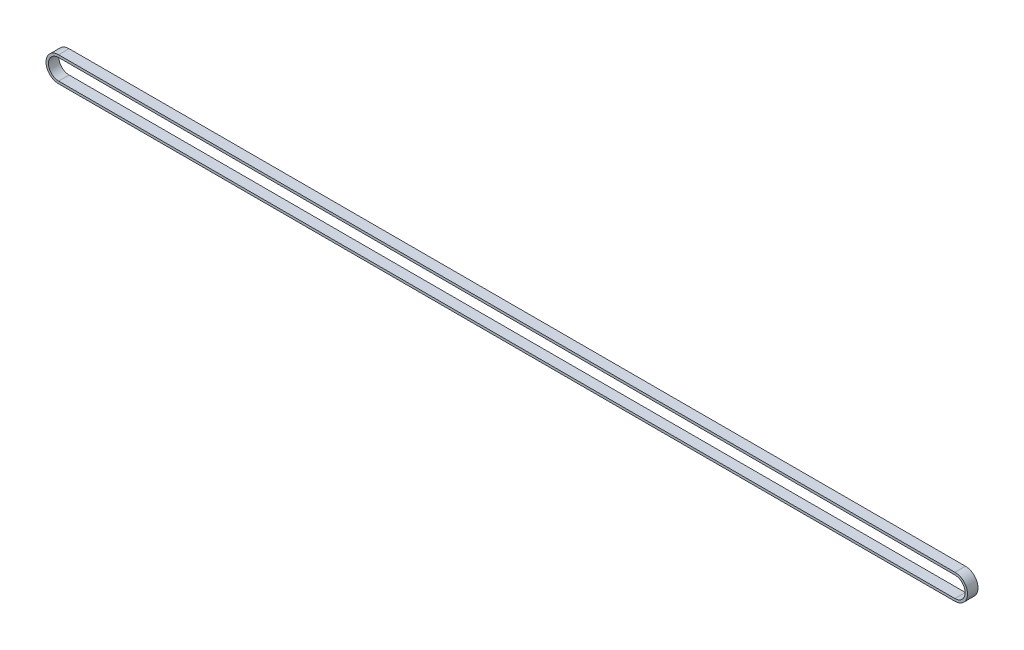
ISO-10303-21;
HEADER;
FILE_DESCRIPTION(('STEP AP214'),'2;1');
FILE_NAME('part.step','',(''),(''),'','','');
FILE_SCHEMA(('AUTOMOTIVE_DESIGN { 1 0 10303 214 1 1 1 1 }'));
ENDSEC;
DATA;
#1=APPLICATION_CONTEXT('core data for automotive mechanical design processes');
#2=APPLICATION_PROTOCOL_DEFINITION('international standard','automotive_design',2000,#1);
#3=PRODUCT_CONTEXT('',#1,'mechanical');
#4=PRODUCT('Part','Part','',(#3));
#5=PRODUCT_RELATED_PRODUCT_CATEGORY('part','',(#4));
#6=PRODUCT_DEFINITION_FORMATION('','',#4);
#7=PRODUCT_DEFINITION_CONTEXT('part definition',#1,'design');
#8=PRODUCT_DEFINITION('design','',#6,#7);
#9=PRODUCT_DEFINITION_SHAPE('','',#8);
#10=(LENGTH_UNIT() NAMED_UNIT(*) SI_UNIT(.MILLI.,.METRE.));
#11=(NAMED_UNIT(*) PLANE_ANGLE_UNIT() SI_UNIT($,.RADIAN.));
#12=(NAMED_UNIT(*) SI_UNIT($,.STERADIAN.) SOLID_ANGLE_UNIT());
#13=UNCERTAINTY_MEASURE_WITH_UNIT(LENGTH_MEASURE(1.E-05),#10,'distance_accuracy_value','');
#14=(GEOMETRIC_REPRESENTATION_CONTEXT(3) GLOBAL_UNCERTAINTY_ASSIGNED_CONTEXT((#13)) GLOBAL_UNIT_ASSIGNED_CONTEXT((#10,
#11,#12)) REPRESENTATION_CONTEXT('',''));
#15=CARTESIAN_POINT('',(0.,0.,0.));
#16=DIRECTION('',(0.,0.,1.));
#17=DIRECTION('',(1.,0.,0.));
#18=AXIS2_PLACEMENT_3D('',#15,#16,#17);
#19=CARTESIAN_POINT('',(0.,0.,6.));
#20=DIRECTION('',(0.,0.,1.));
#21=DIRECTION('',(1.,0.,0.));
#22=AXIS2_PLACEMENT_3D('',#19,#20,#21);
#23=PLANE('',#22);
#24=CARTESIAN_POINT('',(0.,0.,6.));
#25=DIRECTION('',(0.,0.,1.));
#26=DIRECTION('',(1.,0.,0.));
#27=AXIS2_PLACEMENT_3D('',#24,#25,#26);
#28=CIRCLE('',#27,7.213);
#29=CARTESIAN_POINT('',(0.,7.213,6.));
#30=VERTEX_POINT('',#29);
#31=CARTESIAN_POINT('',(0.,-7.213,6.));
#32=VERTEX_POINT('',#31);
#33=EDGE_CURVE('E133',#30,#32,#28,.T.);
#34=ORIENTED_EDGE('',*,*,#33,.T.);
#35=DIRECTION('',(1.,0.,0.));
#36=VECTOR('',#35,1.);
#37=CARTESIAN_POINT('',(0.,-7.213,6.));
#38=LINE('',#37,#36);
#39=CARTESIAN_POINT('',(513.,-7.213,6.));
#40=VERTEX_POINT('',#39);
#41=EDGE_CURVE('E136',#32,#40,#38,.T.);
#42=ORIENTED_EDGE('',*,*,#41,.T.);
#43=CARTESIAN_POINT('',(513.,0.,6.));
#44=DIRECTION('',(0.,0.,1.));
#45=DIRECTION('',(1.,0.,0.));
#46=AXIS2_PLACEMENT_3D('',#43,#44,#45);
#47=CIRCLE('',#46,7.213);
#48=CARTESIAN_POINT('',(513.,7.213,6.));
#49=VERTEX_POINT('',#48);
#50=EDGE_CURVE('E139',#40,#49,#47,.T.);
#51=ORIENTED_EDGE('',*,*,#50,.T.);
#52=DIRECTION('',(-1.,0.,0.));
#53=VECTOR('',#52,1.);
#54=CARTESIAN_POINT('',(0.,7.213,6.));
#55=LINE('',#54,#53);
#56=EDGE_CURVE('E141',#49,#30,#55,.T.);
#57=ORIENTED_EDGE('',*,*,#56,.T.);
#58=EDGE_LOOP('',(#34,#42,#51,#57));
#59=FACE_BOUND('',#58,.T.);
#60=DIRECTION('',(1.,0.,0.));
#61=VECTOR('',#60,1.);
#62=CARTESIAN_POINT('',(513.,-5.833,6.));
#63=LINE('',#62,#61);
#64=CARTESIAN_POINT('',(0.,-5.833,6.));
#65=VERTEX_POINT('',#64);
#66=CARTESIAN_POINT('',(513.,-5.833,6.));
#67=VERTEX_POINT('',#66);
#68=EDGE_CURVE('E105',#65,#67,#63,.T.);
#69=ORIENTED_EDGE('',*,*,#68,.F.);
#70=CARTESIAN_POINT('',(0.,0.,6.));
#71=DIRECTION('',(0.,0.,1.));
#72=DIRECTION('',(1.,0.,0.));
#73=AXIS2_PLACEMENT_3D('',#70,#71,#72);
#74=CIRCLE('',#73,5.833);
#75=CARTESIAN_POINT('',(0.,5.833,6.));
#76=VERTEX_POINT('',#75);
#77=EDGE_CURVE('E97',#76,#65,#74,.T.);
#78=ORIENTED_EDGE('',*,*,#77,.F.);
#79=DIRECTION('',(-1.,0.,0.));
#80=VECTOR('',#79,1.);
#81=CARTESIAN_POINT('',(0.,5.833,6.));
#82=LINE('',#81,#80);
#83=CARTESIAN_POINT('',(513.,5.833,6.));
#84=VERTEX_POINT('',#83);
#85=EDGE_CURVE('E119',#84,#76,#82,.T.);
#86=ORIENTED_EDGE('',*,*,#85,.F.);
#87=CARTESIAN_POINT('',(513.,0.,6.));
#88=DIRECTION('',(0.,0.,1.));
#89=DIRECTION('',(1.,0.,0.));
#90=AXIS2_PLACEMENT_3D('',#87,#88,#89);
#91=CIRCLE('',#90,5.833);
#92=EDGE_CURVE('E117',#67,#84,#91,.T.);
#93=ORIENTED_EDGE('',*,*,#92,.F.);
#94=EDGE_LOOP('',(#69,#78,#86,#93));
#95=FACE_BOUND('',#94,.T.);
#96=ADVANCED_FACE('F32',(#59,#95),#23,.T.);
#97=CARTESIAN_POINT('',(0.,0.,0.));
#98=DIRECTION('',(0.,0.,1.));
#99=DIRECTION('',(1.,0.,0.));
#100=AXIS2_PLACEMENT_3D('',#97,#98,#99);
#101=PLANE('',#100);
#102=CARTESIAN_POINT('',(0.,0.,0.));
#103=DIRECTION('',(0.,0.,1.));
#104=DIRECTION('',(1.,0.,0.));
#105=AXIS2_PLACEMENT_3D('',#102,#103,#104);
#106=CIRCLE('',#105,7.213);
#107=CARTESIAN_POINT('',(0.,7.213,0.));
#108=VERTEX_POINT('',#107);
#109=CARTESIAN_POINT('',(0.,-7.213,0.));
#110=VERTEX_POINT('',#109);
#111=EDGE_CURVE('E113',#108,#110,#106,.T.);
#112=ORIENTED_EDGE('',*,*,#111,.F.);
#113=DIRECTION('',(-1.,0.,0.));
#114=VECTOR('',#113,1.);
#115=CARTESIAN_POINT('',(0.,7.213,0.));
#116=LINE('',#115,#114);
#117=CARTESIAN_POINT('',(513.,7.213,0.));
#118=VERTEX_POINT('',#117);
#119=EDGE_CURVE('E137',#118,#108,#116,.T.);
#120=ORIENTED_EDGE('',*,*,#119,.F.);
#121=CARTESIAN_POINT('',(513.,0.,0.));
#122=DIRECTION('',(0.,0.,1.));
#123=DIRECTION('',(1.,0.,0.));
#124=AXIS2_PLACEMENT_3D('',#121,#122,#123);
#125=CIRCLE('',#124,7.213);
#126=CARTESIAN_POINT('',(513.,-7.213,0.));
#127=VERTEX_POINT('',#126);
#128=EDGE_CURVE('E148',#127,#118,#125,.T.);
#129=ORIENTED_EDGE('',*,*,#128,.F.);
#130=DIRECTION('',(1.,0.,0.));
#131=VECTOR('',#130,1.);
#132=CARTESIAN_POINT('',(0.,-7.213,0.));
#133=LINE('',#132,#131);
#134=EDGE_CURVE('E146',#110,#127,#133,.T.);
#135=ORIENTED_EDGE('',*,*,#134,.F.);
#136=EDGE_LOOP('',(#112,#120,#129,#135));
#137=FACE_BOUND('',#136,.T.);
#138=CARTESIAN_POINT('',(0.,0.,0.));
#139=DIRECTION('',(0.,0.,1.));
#140=DIRECTION('',(1.,0.,0.));
#141=AXIS2_PLACEMENT_3D('',#138,#139,#140);
#142=CIRCLE('',#141,5.833);
#143=CARTESIAN_POINT('',(0.,5.833,0.));
#144=VERTEX_POINT('',#143);
#145=CARTESIAN_POINT('',(0.,-5.833,0.));
#146=VERTEX_POINT('',#145);
#147=EDGE_CURVE('E55',#144,#146,#142,.T.);
#148=ORIENTED_EDGE('',*,*,#147,.T.);
#149=DIRECTION('',(1.,0.,0.));
#150=VECTOR('',#149,1.);
#151=CARTESIAN_POINT('',(513.,-5.833,0.));
#152=LINE('',#151,#150);
#153=CARTESIAN_POINT('',(513.,-5.833,0.));
#154=VERTEX_POINT('',#153);
#155=EDGE_CURVE('E112',#146,#154,#152,.T.);
#156=ORIENTED_EDGE('',*,*,#155,.T.);
#157=CARTESIAN_POINT('',(513.,0.,0.));
#158=DIRECTION('',(0.,0.,1.));
#159=DIRECTION('',(1.,0.,0.));
#160=AXIS2_PLACEMENT_3D('',#157,#158,#159);
#161=CIRCLE('',#160,5.833);
#162=CARTESIAN_POINT('',(513.,5.833,0.));
#163=VERTEX_POINT('',#162);
#164=EDGE_CURVE('E125',#154,#163,#161,.T.);
#165=ORIENTED_EDGE('',*,*,#164,.T.);
#166=DIRECTION('',(-1.,0.,0.));
#167=VECTOR('',#166,1.);
#168=CARTESIAN_POINT('',(0.,5.833,0.));
#169=LINE('',#168,#167);
#170=EDGE_CURVE('E106',#163,#144,#169,.T.);
#171=ORIENTED_EDGE('',*,*,#170,.T.);
#172=EDGE_LOOP('',(#148,#156,#165,#171));
#173=FACE_BOUND('',#172,.T.);
#174=ADVANCED_FACE('F166',(#137,#173),#101,.F.);
#175=CARTESIAN_POINT('',(0.,0.,6.));
#176=DIRECTION('',(0.,0.,-1.));
#177=DIRECTION('',(-1.,0.,0.));
#178=AXIS2_PLACEMENT_3D('',#175,#176,#177);
#179=CYLINDRICAL_SURFACE('',#178,7.213);
#180=ORIENTED_EDGE('',*,*,#111,.T.);
#181=DIRECTION('',(0.,0.,-1.));
#182=VECTOR('',#181,1.);
#183=CARTESIAN_POINT('',(0.,-7.213,6.));
#184=LINE('',#183,#182);
#185=EDGE_CURVE('E11',#32,#110,#184,.T.);
#186=ORIENTED_EDGE('',*,*,#185,.F.);
#187=ORIENTED_EDGE('',*,*,#33,.F.);
#188=DIRECTION('',(0.,0.,-1.));
#189=VECTOR('',#188,1.);
#190=CARTESIAN_POINT('',(0.,7.213,6.));
#191=LINE('',#190,#189);
#192=EDGE_CURVE('E143',#30,#108,#191,.T.);
#193=ORIENTED_EDGE('',*,*,#192,.T.);
#194=EDGE_LOOP('',(#180,#186,#187,#193));
#195=FACE_BOUND('',#194,.T.);
#196=ADVANCED_FACE('F34',(#195),#179,.T.);
#197=CARTESIAN_POINT('',(0.,-7.213,6.));
#198=DIRECTION('',(0.,1.,0.));
#199=DIRECTION('',(0.,0.,1.));
#200=AXIS2_PLACEMENT_3D('',#197,#198,#199);
#201=PLANE('',#200);
#202=ORIENTED_EDGE('',*,*,#134,.T.);
#203=DIRECTION('',(0.,0.,-1.));
#204=VECTOR('',#203,1.);
#205=CARTESIAN_POINT('',(513.,-7.213,6.));
#206=LINE('',#205,#204);
#207=EDGE_CURVE('E40',#40,#127,#206,.T.);
#208=ORIENTED_EDGE('',*,*,#207,.F.);
#209=ORIENTED_EDGE('',*,*,#41,.F.);
#210=ORIENTED_EDGE('',*,*,#185,.T.);
#211=EDGE_LOOP('',(#202,#208,#209,#210));
#212=FACE_BOUND('',#211,.T.);
#213=ADVANCED_FACE('F176',(#212),#201,.F.);
#214=CARTESIAN_POINT('',(513.,0.,6.));
#215=DIRECTION('',(0.,0.,-1.));
#216=DIRECTION('',(-1.,0.,0.));
#217=AXIS2_PLACEMENT_3D('',#214,#215,#216);
#218=CYLINDRICAL_SURFACE('',#217,7.213);
#219=ORIENTED_EDGE('',*,*,#128,.T.);
#220=DIRECTION('',(0.,0.,-1.));
#221=VECTOR('',#220,1.);
#222=CARTESIAN_POINT('',(513.,7.213,6.));
#223=LINE('',#222,#221);
#224=EDGE_CURVE('E153',#49,#118,#223,.T.);
#225=ORIENTED_EDGE('',*,*,#224,.F.);
#226=ORIENTED_EDGE('',*,*,#50,.F.);
#227=ORIENTED_EDGE('',*,*,#207,.T.);
#228=EDGE_LOOP('',(#219,#225,#226,#227));
#229=FACE_BOUND('',#228,.T.);
#230=ADVANCED_FACE('F160',(#229),#218,.T.);
#231=CARTESIAN_POINT('',(0.,7.213,6.));
#232=DIRECTION('',(0.,-1.,0.));
#233=DIRECTION('',(0.,0.,-1.));
#234=AXIS2_PLACEMENT_3D('',#231,#232,#233);
#235=PLANE('',#234);
#236=ORIENTED_EDGE('',*,*,#119,.T.);
#237=ORIENTED_EDGE('',*,*,#192,.F.);
#238=ORIENTED_EDGE('',*,*,#56,.F.);
#239=ORIENTED_EDGE('',*,*,#224,.T.);
#240=EDGE_LOOP('',(#236,#237,#238,#239));
#241=FACE_BOUND('',#240,.T.);
#242=ADVANCED_FACE('F170',(#241),#235,.F.);
#243=CARTESIAN_POINT('',(0.,0.,6.));
#244=DIRECTION('',(0.,0.,-1.));
#245=DIRECTION('',(-1.,0.,0.));
#246=AXIS2_PLACEMENT_3D('',#243,#244,#245);
#247=CYLINDRICAL_SURFACE('',#246,5.833);
#248=ORIENTED_EDGE('',*,*,#147,.F.);
#249=DIRECTION('',(0.,0.,-1.));
#250=VECTOR('',#249,1.);
#251=CARTESIAN_POINT('',(0.,5.833,6.));
#252=LINE('',#251,#250);
#253=EDGE_CURVE('E101',#76,#144,#252,.T.);
#254=ORIENTED_EDGE('',*,*,#253,.F.);
#255=ORIENTED_EDGE('',*,*,#77,.T.);
#256=DIRECTION('',(0.,0.,-1.));
#257=VECTOR('',#256,1.);
#258=CARTESIAN_POINT('',(0.,-5.833,6.));
#259=LINE('',#258,#257);
#260=EDGE_CURVE('E100',#65,#146,#259,.T.);
#261=ORIENTED_EDGE('',*,*,#260,.T.);
#262=EDGE_LOOP('',(#248,#254,#255,#261));
#263=FACE_BOUND('',#262,.T.);
#264=ADVANCED_FACE('F99',(#263),#247,.F.);
#265=CARTESIAN_POINT('',(513.,-5.833,6.));
#266=DIRECTION('',(0.,1.,0.));
#267=DIRECTION('',(0.,0.,1.));
#268=AXIS2_PLACEMENT_3D('',#265,#266,#267);
#269=PLANE('',#268);
#270=ORIENTED_EDGE('',*,*,#155,.F.);
#271=ORIENTED_EDGE('',*,*,#260,.F.);
#272=ORIENTED_EDGE('',*,*,#68,.T.);
#273=DIRECTION('',(0.,0.,-1.));
#274=VECTOR('',#273,1.);
#275=CARTESIAN_POINT('',(513.,-5.833,6.));
#276=LINE('',#275,#274);
#277=EDGE_CURVE('E114',#67,#154,#276,.T.);
#278=ORIENTED_EDGE('',*,*,#277,.T.);
#279=EDGE_LOOP('',(#270,#271,#272,#278));
#280=FACE_BOUND('',#279,.T.);
#281=ADVANCED_FACE('F109',(#280),#269,.T.);
#282=CARTESIAN_POINT('',(513.,0.,6.));
#283=DIRECTION('',(0.,0.,-1.));
#284=DIRECTION('',(-1.,0.,0.));
#285=AXIS2_PLACEMENT_3D('',#282,#283,#284);
#286=CYLINDRICAL_SURFACE('',#285,5.833);
#287=ORIENTED_EDGE('',*,*,#164,.F.);
#288=ORIENTED_EDGE('',*,*,#277,.F.);
#289=ORIENTED_EDGE('',*,*,#92,.T.);
#290=DIRECTION('',(0.,0.,-1.));
#291=VECTOR('',#290,1.);
#292=CARTESIAN_POINT('',(513.,5.833,6.));
#293=LINE('',#292,#291);
#294=EDGE_CURVE('E47',#84,#163,#293,.T.);
#295=ORIENTED_EDGE('',*,*,#294,.T.);
#296=EDGE_LOOP('',(#287,#288,#289,#295));
#297=FACE_BOUND('',#296,.T.);
#298=ADVANCED_FACE('F199',(#297),#286,.F.);
#299=CARTESIAN_POINT('',(0.,5.833,6.));
#300=DIRECTION('',(0.,-1.,0.));
#301=DIRECTION('',(0.,0.,-1.));
#302=AXIS2_PLACEMENT_3D('',#299,#300,#301);
#303=PLANE('',#302);
#304=ORIENTED_EDGE('',*,*,#170,.F.);
#305=ORIENTED_EDGE('',*,*,#294,.F.);
#306=ORIENTED_EDGE('',*,*,#85,.T.);
#307=ORIENTED_EDGE('',*,*,#253,.T.);
#308=EDGE_LOOP('',(#304,#305,#306,#307));
#309=FACE_BOUND('',#308,.T.);
#310=ADVANCED_FACE('F203',(#309),#303,.T.);
#311=CLOSED_SHELL('',(#96,#174,#196,#213,#230,#242,#264,#281,#298,#310));
#312=MANIFOLD_SOLID_BREP('B2',#311);
#313=ADVANCED_BREP_SHAPE_REPRESENTATION('',(#18,#312),#14);
#314=SHAPE_DEFINITION_REPRESENTATION(#9,#313);
ENDSEC;
END-ISO-10303-21;
